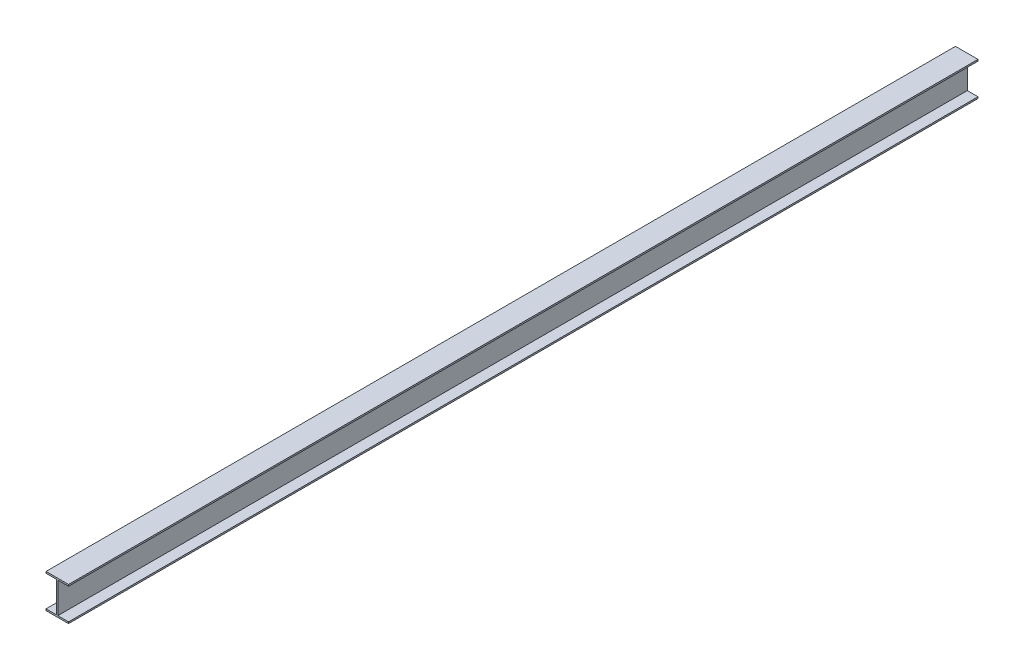
ISO-10303-21;
HEADER;
FILE_DESCRIPTION(('STEP AP214'),'2;1');
FILE_NAME('part.step','',(''),(''),'','','');
FILE_SCHEMA(('AUTOMOTIVE_DESIGN { 1 0 10303 214 1 1 1 1 }'));
ENDSEC;
DATA;
#1=APPLICATION_CONTEXT('core data for automotive mechanical design processes');
#2=APPLICATION_PROTOCOL_DEFINITION('international standard','automotive_design',2000,#1);
#3=PRODUCT_CONTEXT('',#1,'mechanical');
#4=PRODUCT('Part','Part','',(#3));
#5=PRODUCT_RELATED_PRODUCT_CATEGORY('part','',(#4));
#6=PRODUCT_DEFINITION_FORMATION('','',#4);
#7=PRODUCT_DEFINITION_CONTEXT('part definition',#1,'design');
#8=PRODUCT_DEFINITION('design','',#6,#7);
#9=PRODUCT_DEFINITION_SHAPE('','',#8);
#10=(LENGTH_UNIT() NAMED_UNIT(*) SI_UNIT(.MILLI.,.METRE.));
#11=(NAMED_UNIT(*) PLANE_ANGLE_UNIT() SI_UNIT($,.RADIAN.));
#12=(NAMED_UNIT(*) SI_UNIT($,.STERADIAN.) SOLID_ANGLE_UNIT());
#13=UNCERTAINTY_MEASURE_WITH_UNIT(LENGTH_MEASURE(1.E-05),#10,'distance_accuracy_value','');
#14=(GEOMETRIC_REPRESENTATION_CONTEXT(3) GLOBAL_UNCERTAINTY_ASSIGNED_CONTEXT((#13)) GLOBAL_UNIT_ASSIGNED_CONTEXT((#10,
#11,#12)) REPRESENTATION_CONTEXT('',''));
#15=CARTESIAN_POINT('',(0.,0.,0.));
#16=DIRECTION('',(0.,0.,1.));
#17=DIRECTION('',(1.,0.,0.));
#18=AXIS2_PLACEMENT_3D('',#15,#16,#17);
#19=CARTESIAN_POINT('',(101.6,-153.162240532958,4100.));
#20=DIRECTION('',(0.,1.,0.));
#21=DIRECTION('',(0.,0.,1.));
#22=AXIS2_PLACEMENT_3D('',#19,#20,#21);
#23=PLANE('',#22);
#24=DIRECTION('',(-1.,0.,0.));
#25=VECTOR('',#24,1.);
#26=CARTESIAN_POINT('',(101.600000000003,-153.162240532958,2202.4));
#27=LINE('',#26,#25);
#28=CARTESIAN_POINT('',(101.6,-153.162240532958,2202.4));
#29=VERTEX_POINT('',#28);
#30=CARTESIAN_POINT('',(0.,-153.162240532958,2202.4));
#31=VERTEX_POINT('',#30);
#32=EDGE_CURVE('E11',#29,#31,#27,.T.);
#33=ORIENTED_EDGE('',*,*,#32,.F.);
#34=DIRECTION('',(0.,0.,-1.));
#35=VECTOR('',#34,1.);
#36=CARTESIAN_POINT('',(101.6,-153.162240532958,4100.));
#37=LINE('',#36,#35);
#38=CARTESIAN_POINT('',(101.6,-153.162240532958,4100.));
#39=VERTEX_POINT('',#38);
#40=EDGE_CURVE('E177',#39,#29,#37,.T.);
#41=ORIENTED_EDGE('',*,*,#40,.F.);
#42=DIRECTION('',(1.,0.,0.));
#43=VECTOR('',#42,1.);
#44=CARTESIAN_POINT('',(101.6,-153.162240532958,4100.));
#45=LINE('',#44,#43);
#46=CARTESIAN_POINT('',(0.,-153.162240532958,4100.));
#47=VERTEX_POINT('',#46);
#48=EDGE_CURVE('E234',#47,#39,#45,.T.);
#49=ORIENTED_EDGE('',*,*,#48,.F.);
#50=DIRECTION('',(0.,0.,-1.));
#51=VECTOR('',#50,1.);
#52=CARTESIAN_POINT('',(0.,-153.162240532958,4100.));
#53=LINE('',#52,#51);
#54=EDGE_CURVE('E172',#47,#31,#53,.T.);
#55=ORIENTED_EDGE('',*,*,#54,.T.);
#56=EDGE_LOOP('',(#33,#41,#49,#55));
#57=FACE_BOUND('',#56,.T.);
#58=ADVANCED_FACE('F35',(#57),#23,.F.);
#59=DIRECTION('',(1.,0.,0.));
#60=VECTOR('',#59,1.);
#61=CARTESIAN_POINT('',(101.6,-153.162240532958,1897.6));
#62=LINE('',#61,#60);
#63=CARTESIAN_POINT('',(0.,-153.162240532958,1897.6));
#64=VERTEX_POINT('',#63);
#65=CARTESIAN_POINT('',(101.6,-153.162240532958,1897.6));
#66=VERTEX_POINT('',#65);
#67=EDGE_CURVE('E44',#64,#66,#62,.T.);
#68=ORIENTED_EDGE('',*,*,#67,.F.);
#69=CARTESIAN_POINT('',(0.,-153.162240532958,0.));
#70=VERTEX_POINT('',#69);
#71=EDGE_CURVE('E176',#64,#70,#53,.T.);
#72=ORIENTED_EDGE('',*,*,#71,.T.);
#73=DIRECTION('',(1.,0.,0.));
#74=VECTOR('',#73,1.);
#75=CARTESIAN_POINT('',(101.6,-153.162240532958,0.));
#76=LINE('',#75,#74);
#77=CARTESIAN_POINT('',(101.6,-153.162240532958,0.));
#78=VERTEX_POINT('',#77);
#79=EDGE_CURVE('E210',#70,#78,#76,.T.);
#80=ORIENTED_EDGE('',*,*,#79,.T.);
#81=EDGE_CURVE('E181',#66,#78,#37,.T.);
#82=ORIENTED_EDGE('',*,*,#81,.F.);
#83=EDGE_LOOP('',(#68,#72,#80,#82));
#84=FACE_BOUND('',#83,.T.);
#85=ADVANCED_FACE('F292',(#84),#23,.F.);
#86=CARTESIAN_POINT('',(0.,-7.11224053295814,4100.));
#87=DIRECTION('',(1.,0.,0.));
#88=DIRECTION('',(0.,0.,-1.));
#89=AXIS2_PLACEMENT_3D('',#86,#87,#88);
#90=PLANE('',#89);
#91=DIRECTION('',(0.,-1.,0.));
#92=VECTOR('',#91,1.);
#93=CARTESIAN_POINT('',(0.,-7.11224053295814,0.));
#94=LINE('',#93,#92);
#95=CARTESIAN_POINT('',(0.,-0.000240532958142959,0.));
#96=VERTEX_POINT('',#95);
#97=CARTESIAN_POINT('',(0.,-7.11224053295814,0.));
#98=VERTEX_POINT('',#97);
#99=EDGE_CURVE('E161',#96,#98,#94,.T.);
#100=ORIENTED_EDGE('',*,*,#99,.T.);
#101=DIRECTION('',(0.,0.,-1.));
#102=VECTOR('',#101,1.);
#103=CARTESIAN_POINT('',(0.,-7.11224053295814,4100.));
#104=LINE('',#103,#102);
#105=CARTESIAN_POINT('',(0.,-7.11224053295814,4100.));
#106=VERTEX_POINT('',#105);
#107=EDGE_CURVE('E142',#106,#98,#104,.T.);
#108=ORIENTED_EDGE('',*,*,#107,.F.);
#109=DIRECTION('',(0.,-1.,0.));
#110=VECTOR('',#109,1.);
#111=CARTESIAN_POINT('',(0.,-7.11224053295814,4100.));
#112=LINE('',#111,#110);
#113=CARTESIAN_POINT('',(0.,-0.000240532958142959,4100.));
#114=VERTEX_POINT('',#113);
#115=EDGE_CURVE('E149',#114,#106,#112,.T.);
#116=ORIENTED_EDGE('',*,*,#115,.F.);
#117=DIRECTION('',(0.,0.,-1.));
#118=VECTOR('',#117,1.);
#119=CARTESIAN_POINT('',(0.,-0.000240532958142959,4100.));
#120=LINE('',#119,#118);
#121=EDGE_CURVE('E197',#114,#96,#120,.T.);
#122=ORIENTED_EDGE('',*,*,#121,.T.);
#123=EDGE_LOOP('',(#100,#108,#116,#122));
#124=FACE_BOUND('',#123,.T.);
#125=ADVANCED_FACE('F37',(#124),#90,.F.);
#126=CARTESIAN_POINT('',(47.5660357142857,-7.11224053295814,4100.));
#127=DIRECTION('',(0.,1.,0.));
#128=DIRECTION('',(-1.,0.,0.));
#129=AXIS2_PLACEMENT_3D('',#126,#127,#128);
#130=PLANE('',#129);
#131=DIRECTION('',(1.,0.,0.));
#132=VECTOR('',#131,1.);
#133=CARTESIAN_POINT('',(47.5660357142857,-7.11224053295814,0.));
#134=LINE('',#133,#132);
#135=CARTESIAN_POINT('',(47.5660357142857,-7.11224053295814,0.));
#136=VERTEX_POINT('',#135);
#137=EDGE_CURVE('E220',#98,#136,#134,.T.);
#138=ORIENTED_EDGE('',*,*,#137,.T.);
#139=DIRECTION('',(0.,0.,-1.));
#140=VECTOR('',#139,1.);
#141=CARTESIAN_POINT('',(47.5660357142857,-7.11224053295814,4100.));
#142=LINE('',#141,#140);
#143=CARTESIAN_POINT('',(47.5660357142857,-7.11224053295814,4100.));
#144=VERTEX_POINT('',#143);
#145=EDGE_CURVE('E145',#144,#136,#142,.T.);
#146=ORIENTED_EDGE('',*,*,#145,.F.);
#147=DIRECTION('',(1.,0.,0.));
#148=VECTOR('',#147,1.);
#149=CARTESIAN_POINT('',(47.5660357142857,-7.11224053295814,4100.));
#150=LINE('',#149,#148);
#151=EDGE_CURVE('E138',#106,#144,#150,.T.);
#152=ORIENTED_EDGE('',*,*,#151,.F.);
#153=ORIENTED_EDGE('',*,*,#107,.T.);
#154=EDGE_LOOP('',(#138,#146,#152,#153));
#155=FACE_BOUND('',#154,.T.);
#156=ADVANCED_FACE('F140',(#155),#130,.F.);
#157=CARTESIAN_POINT('',(47.5660357142857,-146.050240532958,4100.));
#158=DIRECTION('',(1.,0.,0.));
#159=DIRECTION('',(0.,0.,-1.));
#160=AXIS2_PLACEMENT_3D('',#157,#158,#159);
#161=PLANE('',#160);
#162=DIRECTION('',(0.,-1.,0.));
#163=VECTOR('',#162,1.);
#164=CARTESIAN_POINT('',(47.5660357142857,-146.050240532958,0.));
#165=LINE('',#164,#163);
#166=CARTESIAN_POINT('',(47.5660357142857,-146.050240532958,0.));
#167=VERTEX_POINT('',#166);
#168=EDGE_CURVE('E218',#136,#167,#165,.T.);
#169=ORIENTED_EDGE('',*,*,#168,.T.);
#170=DIRECTION('',(0.,0.,-1.));
#171=VECTOR('',#170,1.);
#172=CARTESIAN_POINT('',(47.5660357142857,-146.050240532958,4100.));
#173=LINE('',#172,#171);
#174=CARTESIAN_POINT('',(47.5660357142857,-146.050240532958,4100.));
#175=VERTEX_POINT('',#174);
#176=EDGE_CURVE('E164',#175,#167,#173,.T.);
#177=ORIENTED_EDGE('',*,*,#176,.F.);
#178=DIRECTION('',(0.,-1.,0.));
#179=VECTOR('',#178,1.);
#180=CARTESIAN_POINT('',(47.5660357142857,-146.050240532958,4100.));
#181=LINE('',#180,#179);
#182=EDGE_CURVE('E148',#144,#175,#181,.T.);
#183=ORIENTED_EDGE('',*,*,#182,.F.);
#184=ORIENTED_EDGE('',*,*,#145,.T.);
#185=EDGE_LOOP('',(#169,#177,#183,#184));
#186=FACE_BOUND('',#185,.T.);
#187=ADVANCED_FACE('F244',(#186),#161,.F.);
#188=CARTESIAN_POINT('',(0.,-146.050240532958,4100.));
#189=DIRECTION('',(0.,-1.,0.));
#190=DIRECTION('',(1.,0.,0.));
#191=AXIS2_PLACEMENT_3D('',#188,#189,#190);
#192=PLANE('',#191);
#193=DIRECTION('',(-1.,0.,0.));
#194=VECTOR('',#193,1.);
#195=CARTESIAN_POINT('',(0.,-146.050240532958,0.));
#196=LINE('',#195,#194);
#197=CARTESIAN_POINT('',(0.,-146.050240532958,0.));
#198=VERTEX_POINT('',#197);
#199=EDGE_CURVE('E216',#167,#198,#196,.T.);
#200=ORIENTED_EDGE('',*,*,#199,.T.);
#201=DIRECTION('',(0.,0.,-1.));
#202=VECTOR('',#201,1.);
#203=CARTESIAN_POINT('',(0.,-146.050240532958,4100.));
#204=LINE('',#203,#202);
#205=CARTESIAN_POINT('',(0.,-146.050240532958,4100.));
#206=VERTEX_POINT('',#205);
#207=EDGE_CURVE('E169',#206,#198,#204,.T.);
#208=ORIENTED_EDGE('',*,*,#207,.F.);
#209=DIRECTION('',(-1.,0.,0.));
#210=VECTOR('',#209,1.);
#211=CARTESIAN_POINT('',(0.,-146.050240532958,4100.));
#212=LINE('',#211,#210);
#213=EDGE_CURVE('E238',#175,#206,#212,.T.);
#214=ORIENTED_EDGE('',*,*,#213,.F.);
#215=ORIENTED_EDGE('',*,*,#176,.T.);
#216=EDGE_LOOP('',(#200,#208,#214,#215));
#217=FACE_BOUND('',#216,.T.);
#218=ADVANCED_FACE('F248',(#217),#192,.F.);
#219=CARTESIAN_POINT('',(0.,-153.162240532958,4100.));
#220=DIRECTION('',(1.,0.,0.));
#221=DIRECTION('',(0.,0.,-1.));
#222=AXIS2_PLACEMENT_3D('',#219,#220,#221);
#223=PLANE('',#222);
#224=DIRECTION('',(0.,-1.,0.));
#225=VECTOR('',#224,1.);
#226=CARTESIAN_POINT('',(0.,-153.162240532958,0.));
#227=LINE('',#226,#225);
#228=EDGE_CURVE('E213',#198,#70,#227,.T.);
#229=ORIENTED_EDGE('',*,*,#228,.T.);
#230=ORIENTED_EDGE('',*,*,#71,.F.);
#231=EDGE_CURVE('E175',#31,#64,#53,.T.);
#232=ORIENTED_EDGE('',*,*,#231,.F.);
#233=ORIENTED_EDGE('',*,*,#54,.F.);
#234=DIRECTION('',(0.,-1.,0.));
#235=VECTOR('',#234,1.);
#236=CARTESIAN_POINT('',(0.,-153.162240532958,4100.));
#237=LINE('',#236,#235);
#238=EDGE_CURVE('E236',#206,#47,#237,.T.);
#239=ORIENTED_EDGE('',*,*,#238,.F.);
#240=ORIENTED_EDGE('',*,*,#207,.T.);
#241=EDGE_LOOP('',(#229,#230,#232,#233,#239,#240));
#242=FACE_BOUND('',#241,.T.);
#243=ADVANCED_FACE('F253',(#242),#223,.F.);
#244=CARTESIAN_POINT('',(101.6,-153.162240532958,2050.));
#245=VERTEX_POINT('',#244);
#246=EDGE_CURVE('E180',#29,#245,#37,.T.);
#247=ORIENTED_EDGE('',*,*,#246,.F.);
#248=ORIENTED_EDGE('',*,*,#32,.T.);
#249=ORIENTED_EDGE('',*,*,#231,.T.);
#250=ORIENTED_EDGE('',*,*,#67,.T.);
#251=EDGE_CURVE('E291',#245,#66,#37,.T.);
#252=ORIENTED_EDGE('',*,*,#251,.F.);
#253=EDGE_LOOP('',(#247,#248,#249,#250,#252));
#254=FACE_BOUND('',#253,.T.);
#255=ADVANCED_FACE('F289',(#254),#23,.F.);
#256=CARTESIAN_POINT('',(101.6,-146.050240532958,4100.));
#257=DIRECTION('',(-1.,0.,0.));
#258=DIRECTION('',(0.,0.,1.));
#259=AXIS2_PLACEMENT_3D('',#256,#257,#258);
#260=PLANE('',#259);
#261=DIRECTION('',(0.,1.,0.));
#262=VECTOR('',#261,1.);
#263=CARTESIAN_POINT('',(101.6,-146.050240532958,0.));
#264=LINE('',#263,#262);
#265=CARTESIAN_POINT('',(101.6,-146.050240532958,0.));
#266=VERTEX_POINT('',#265);
#267=EDGE_CURVE('E208',#78,#266,#264,.T.);
#268=ORIENTED_EDGE('',*,*,#267,.T.);
#269=DIRECTION('',(0.,0.,-1.));
#270=VECTOR('',#269,1.);
#271=CARTESIAN_POINT('',(101.6,-146.050240532958,4100.));
#272=LINE('',#271,#270);
#273=CARTESIAN_POINT('',(101.6,-146.050240532958,4100.));
#274=VERTEX_POINT('',#273);
#275=EDGE_CURVE('E182',#274,#266,#272,.T.);
#276=ORIENTED_EDGE('',*,*,#275,.F.);
#277=DIRECTION('',(0.,1.,0.));
#278=VECTOR('',#277,1.);
#279=CARTESIAN_POINT('',(101.6,-146.050240532958,4100.));
#280=LINE('',#279,#278);
#281=EDGE_CURVE('E232',#39,#274,#280,.T.);
#282=ORIENTED_EDGE('',*,*,#281,.F.);
#283=ORIENTED_EDGE('',*,*,#40,.T.);
#284=ORIENTED_EDGE('',*,*,#246,.T.);
#285=ORIENTED_EDGE('',*,*,#251,.T.);
#286=ORIENTED_EDGE('',*,*,#81,.T.);
#287=EDGE_LOOP('',(#268,#276,#282,#283,#284,#285,#286));
#288=FACE_BOUND('',#287,.T.);
#289=ADVANCED_FACE('F261',(#288),#260,.F.);
#290=CARTESIAN_POINT('',(53.4080357142857,-146.050240532958,4100.));
#291=DIRECTION('',(0.,-1.,0.));
#292=DIRECTION('',(1.,0.,0.));
#293=AXIS2_PLACEMENT_3D('',#290,#291,#292);
#294=PLANE('',#293);
#295=DIRECTION('',(-1.,0.,0.));
#296=VECTOR('',#295,1.);
#297=CARTESIAN_POINT('',(53.4080357142857,-146.050240532958,0.));
#298=LINE('',#297,#296);
#299=CARTESIAN_POINT('',(53.4080357142857,-146.050240532958,0.));
#300=VERTEX_POINT('',#299);
#301=EDGE_CURVE('E206',#266,#300,#298,.T.);
#302=ORIENTED_EDGE('',*,*,#301,.T.);
#303=DIRECTION('',(0.,0.,-1.));
#304=VECTOR('',#303,1.);
#305=CARTESIAN_POINT('',(53.4080357142857,-146.050240532958,4100.));
#306=LINE('',#305,#304);
#307=CARTESIAN_POINT('',(53.4080357142857,-146.050240532958,4100.));
#308=VERTEX_POINT('',#307);
#309=EDGE_CURVE('E185',#308,#300,#306,.T.);
#310=ORIENTED_EDGE('',*,*,#309,.F.);
#311=DIRECTION('',(-1.,0.,0.));
#312=VECTOR('',#311,1.);
#313=CARTESIAN_POINT('',(53.4080357142857,-146.050240532958,4100.));
#314=LINE('',#313,#312);
#315=EDGE_CURVE('E230',#274,#308,#314,.T.);
#316=ORIENTED_EDGE('',*,*,#315,.F.);
#317=ORIENTED_EDGE('',*,*,#275,.T.);
#318=EDGE_LOOP('',(#302,#310,#316,#317));
#319=FACE_BOUND('',#318,.T.);
#320=ADVANCED_FACE('F267',(#319),#294,.F.);
#321=CARTESIAN_POINT('',(53.4080357142857,-7.11224053295815,4100.));
#322=DIRECTION('',(-1.,0.,0.));
#323=DIRECTION('',(0.,-1.,0.));
#324=AXIS2_PLACEMENT_3D('',#321,#322,#323);
#325=PLANE('',#324);
#326=DIRECTION('',(0.,1.,0.));
#327=VECTOR('',#326,1.);
#328=CARTESIAN_POINT('',(53.4080357142857,-7.11224053295815,0.));
#329=LINE('',#328,#327);
#330=CARTESIAN_POINT('',(53.4080357142857,-7.11224053295815,0.));
#331=VERTEX_POINT('',#330);
#332=EDGE_CURVE('E204',#300,#331,#329,.T.);
#333=ORIENTED_EDGE('',*,*,#332,.T.);
#334=DIRECTION('',(0.,0.,-1.));
#335=VECTOR('',#334,1.);
#336=CARTESIAN_POINT('',(53.4080357142857,-7.11224053295815,4100.));
#337=LINE('',#336,#335);
#338=CARTESIAN_POINT('',(53.4080357142857,-7.11224053295815,4100.));
#339=VERTEX_POINT('',#338);
#340=EDGE_CURVE('E188',#339,#331,#337,.T.);
#341=ORIENTED_EDGE('',*,*,#340,.F.);
#342=DIRECTION('',(0.,1.,0.));
#343=VECTOR('',#342,1.);
#344=CARTESIAN_POINT('',(53.4080357142857,-7.11224053295815,4100.));
#345=LINE('',#344,#343);
#346=EDGE_CURVE('E228',#308,#339,#345,.T.);
#347=ORIENTED_EDGE('',*,*,#346,.F.);
#348=ORIENTED_EDGE('',*,*,#309,.T.);
#349=EDGE_LOOP('',(#333,#341,#347,#348));
#350=FACE_BOUND('',#349,.T.);
#351=ADVANCED_FACE('F273',(#350),#325,.F.);
#352=CARTESIAN_POINT('',(101.6,-7.11224053295814,4100.));
#353=DIRECTION('',(0.,1.,0.));
#354=DIRECTION('',(-1.,0.,0.));
#355=AXIS2_PLACEMENT_3D('',#352,#353,#354);
#356=PLANE('',#355);
#357=DIRECTION('',(1.,0.,0.));
#358=VECTOR('',#357,1.);
#359=CARTESIAN_POINT('',(101.6,-7.11224053295814,0.));
#360=LINE('',#359,#358);
#361=CARTESIAN_POINT('',(101.6,-7.11224053295814,0.));
#362=VERTEX_POINT('',#361);
#363=EDGE_CURVE('E202',#331,#362,#360,.T.);
#364=ORIENTED_EDGE('',*,*,#363,.T.);
#365=DIRECTION('',(0.,0.,-1.));
#366=VECTOR('',#365,1.);
#367=CARTESIAN_POINT('',(101.6,-7.11224053295814,4100.));
#368=LINE('',#367,#366);
#369=CARTESIAN_POINT('',(101.6,-7.11224053295814,4100.));
#370=VERTEX_POINT('',#369);
#371=EDGE_CURVE('E191',#370,#362,#368,.T.);
#372=ORIENTED_EDGE('',*,*,#371,.F.);
#373=DIRECTION('',(1.,0.,0.));
#374=VECTOR('',#373,1.);
#375=CARTESIAN_POINT('',(101.6,-7.11224053295814,4100.));
#376=LINE('',#375,#374);
#377=EDGE_CURVE('E226',#339,#370,#376,.T.);
#378=ORIENTED_EDGE('',*,*,#377,.F.);
#379=ORIENTED_EDGE('',*,*,#340,.T.);
#380=EDGE_LOOP('',(#364,#372,#378,#379));
#381=FACE_BOUND('',#380,.T.);
#382=ADVANCED_FACE('F277',(#381),#356,.F.);
#383=CARTESIAN_POINT('',(101.6,-0.000240532958130516,4100.));
#384=DIRECTION('',(-1.,0.,0.));
#385=DIRECTION('',(0.,0.,1.));
#386=AXIS2_PLACEMENT_3D('',#383,#384,#385);
#387=PLANE('',#386);
#388=DIRECTION('',(0.,1.,0.));
#389=VECTOR('',#388,1.);
#390=CARTESIAN_POINT('',(101.6,-0.000240532958130516,0.));
#391=LINE('',#390,#389);
#392=CARTESIAN_POINT('',(101.6,-0.000240532958130516,0.));
#393=VERTEX_POINT('',#392);
#394=EDGE_CURVE('E200',#362,#393,#391,.T.);
#395=ORIENTED_EDGE('',*,*,#394,.T.);
#396=DIRECTION('',(0.,0.,-1.));
#397=VECTOR('',#396,1.);
#398=CARTESIAN_POINT('',(101.6,-0.000240532958130516,4100.));
#399=LINE('',#398,#397);
#400=CARTESIAN_POINT('',(101.6,-0.000240532958130516,4100.));
#401=VERTEX_POINT('',#400);
#402=EDGE_CURVE('E194',#401,#393,#399,.T.);
#403=ORIENTED_EDGE('',*,*,#402,.F.);
#404=DIRECTION('',(0.,1.,0.));
#405=VECTOR('',#404,1.);
#406=CARTESIAN_POINT('',(101.6,-0.000240532958130516,4100.));
#407=LINE('',#406,#405);
#408=EDGE_CURVE('E224',#370,#401,#407,.T.);
#409=ORIENTED_EDGE('',*,*,#408,.F.);
#410=ORIENTED_EDGE('',*,*,#371,.T.);
#411=EDGE_LOOP('',(#395,#403,#409,#410));
#412=FACE_BOUND('',#411,.T.);
#413=ADVANCED_FACE('F282',(#412),#387,.F.);
#414=CARTESIAN_POINT('',(0.,-0.000240532958142959,4100.));
#415=DIRECTION('',(0.,-1.,0.));
#416=DIRECTION('',(1.,0.,0.));
#417=AXIS2_PLACEMENT_3D('',#414,#415,#416);
#418=PLANE('',#417);
#419=DIRECTION('',(-1.,0.,0.));
#420=VECTOR('',#419,1.);
#421=CARTESIAN_POINT('',(0.,-0.000240532958142959,0.));
#422=LINE('',#421,#420);
#423=EDGE_CURVE('E158',#393,#96,#422,.T.);
#424=ORIENTED_EDGE('',*,*,#423,.T.);
#425=ORIENTED_EDGE('',*,*,#121,.F.);
#426=DIRECTION('',(-1.,0.,0.));
#427=VECTOR('',#426,1.);
#428=CARTESIAN_POINT('',(0.,-0.000240532958142959,4100.));
#429=LINE('',#428,#427);
#430=EDGE_CURVE('E154',#401,#114,#429,.T.);
#431=ORIENTED_EDGE('',*,*,#430,.F.);
#432=ORIENTED_EDGE('',*,*,#402,.T.);
#433=EDGE_LOOP('',(#424,#425,#431,#432));
#434=FACE_BOUND('',#433,.T.);
#435=ADVANCED_FACE('F285',(#434),#418,.F.);
#436=CARTESIAN_POINT('',(0.,0.,4100.));
#437=DIRECTION('',(0.,0.,-1.));
#438=DIRECTION('',(-1.,0.,0.));
#439=AXIS2_PLACEMENT_3D('',#436,#437,#438);
#440=PLANE('',#439);
#441=ORIENTED_EDGE('',*,*,#115,.T.);
#442=ORIENTED_EDGE('',*,*,#151,.T.);
#443=ORIENTED_EDGE('',*,*,#182,.T.);
#444=ORIENTED_EDGE('',*,*,#213,.T.);
#445=ORIENTED_EDGE('',*,*,#238,.T.);
#446=ORIENTED_EDGE('',*,*,#48,.T.);
#447=ORIENTED_EDGE('',*,*,#281,.T.);
#448=ORIENTED_EDGE('',*,*,#315,.T.);
#449=ORIENTED_EDGE('',*,*,#346,.T.);
#450=ORIENTED_EDGE('',*,*,#377,.T.);
#451=ORIENTED_EDGE('',*,*,#408,.T.);
#452=ORIENTED_EDGE('',*,*,#430,.T.);
#453=EDGE_LOOP('',(#441,#442,#443,#444,#445,#446,#447,#448,#449,#450,#451,#452));
#454=FACE_BOUND('',#453,.T.);
#455=ADVANCED_FACE('F152',(#454),#440,.F.);
#456=CARTESIAN_POINT('',(0.,0.,0.));
#457=DIRECTION('',(0.,0.,-1.));
#458=DIRECTION('',(-1.,0.,0.));
#459=AXIS2_PLACEMENT_3D('',#456,#457,#458);
#460=PLANE('',#459);
#461=ORIENTED_EDGE('',*,*,#99,.F.);
#462=ORIENTED_EDGE('',*,*,#423,.F.);
#463=ORIENTED_EDGE('',*,*,#394,.F.);
#464=ORIENTED_EDGE('',*,*,#363,.F.);
#465=ORIENTED_EDGE('',*,*,#332,.F.);
#466=ORIENTED_EDGE('',*,*,#301,.F.);
#467=ORIENTED_EDGE('',*,*,#267,.F.);
#468=ORIENTED_EDGE('',*,*,#79,.F.);
#469=ORIENTED_EDGE('',*,*,#228,.F.);
#470=ORIENTED_EDGE('',*,*,#199,.F.);
#471=ORIENTED_EDGE('',*,*,#168,.F.);
#472=ORIENTED_EDGE('',*,*,#137,.F.);
#473=EDGE_LOOP('',(#461,#462,#463,#464,#465,#466,#467,#468,#469,#470,#471,#472));
#474=FACE_BOUND('',#473,.T.);
#475=ADVANCED_FACE('F287',(#474),#460,.T.);
#476=CLOSED_SHELL('',(#58,#85,#125,#156,#187,#218,#243,#255,#289,#320,#351,#382,#413,#435,#455,#475));
#477=MANIFOLD_SOLID_BREP('B2',#476);
#478=ADVANCED_BREP_SHAPE_REPRESENTATION('',(#18,#477),#14);
#479=SHAPE_DEFINITION_REPRESENTATION(#9,#478);
ENDSEC;
END-ISO-10303-21;
